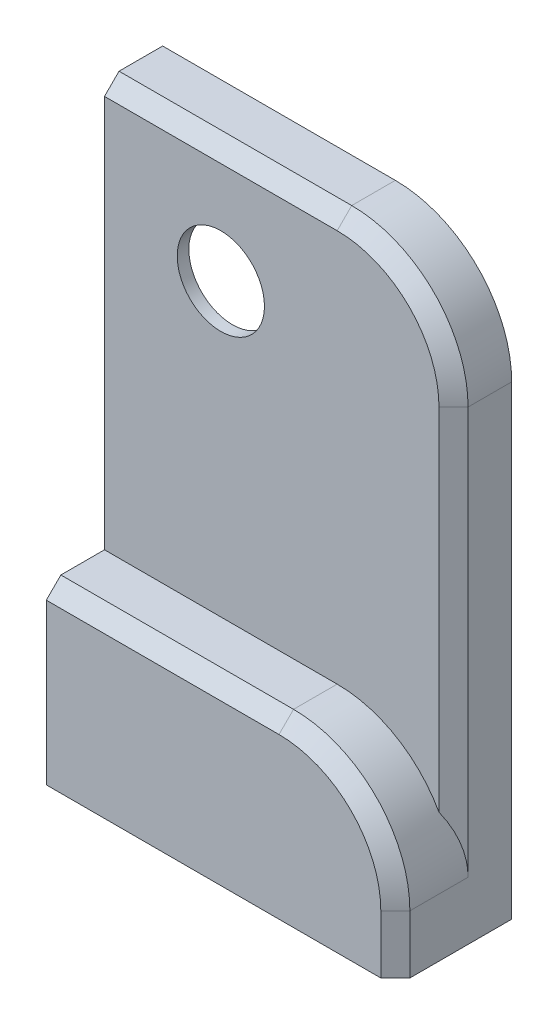
ISO-10303-21;
HEADER;
FILE_DESCRIPTION(('STEP AP214'),'2;1');
FILE_NAME('part.step','',(''),(''),'','','');
FILE_SCHEMA(('AUTOMOTIVE_DESIGN { 1 0 10303 214 1 1 1 1 }'));
ENDSEC;
DATA;
#1=APPLICATION_CONTEXT('core data for automotive mechanical design processes');
#2=APPLICATION_PROTOCOL_DEFINITION('international standard','automotive_design',2000,#1);
#3=PRODUCT_CONTEXT('',#1,'mechanical');
#4=PRODUCT('Part','Part','',(#3));
#5=PRODUCT_RELATED_PRODUCT_CATEGORY('part','',(#4));
#6=PRODUCT_DEFINITION_FORMATION('','',#4);
#7=PRODUCT_DEFINITION_CONTEXT('part definition',#1,'design');
#8=PRODUCT_DEFINITION('design','',#6,#7);
#9=PRODUCT_DEFINITION_SHAPE('','',#8);
#10=(LENGTH_UNIT() NAMED_UNIT(*) SI_UNIT(.MILLI.,.METRE.));
#11=(NAMED_UNIT(*) PLANE_ANGLE_UNIT() SI_UNIT($,.RADIAN.));
#12=(NAMED_UNIT(*) SI_UNIT($,.STERADIAN.) SOLID_ANGLE_UNIT());
#13=UNCERTAINTY_MEASURE_WITH_UNIT(LENGTH_MEASURE(1.E-05),#10,'distance_accuracy_value','');
#14=(GEOMETRIC_REPRESENTATION_CONTEXT(3) GLOBAL_UNCERTAINTY_ASSIGNED_CONTEXT((#13)) GLOBAL_UNIT_ASSIGNED_CONTEXT((#10,
#11,#12)) REPRESENTATION_CONTEXT('',''));
#15=CARTESIAN_POINT('',(0.,0.,0.));
#16=DIRECTION('',(0.,0.,1.));
#17=DIRECTION('',(1.,0.,0.));
#18=AXIS2_PLACEMENT_3D('',#15,#16,#17);
#19=CARTESIAN_POINT('',(0.,0.,0.));
#20=DIRECTION('',(0.,0.,-1.));
#21=DIRECTION('',(-1.,0.,0.));
#22=AXIS2_PLACEMENT_3D('',#19,#20,#21);
#23=PLANE('',#22);
#24=CARTESIAN_POINT('',(-25.4,-25.4,0.));
#25=DIRECTION('',(0.,0.,-1.));
#26=DIRECTION('',(-1.,0.,0.));
#27=AXIS2_PLACEMENT_3D('',#24,#25,#26);
#28=CIRCLE('',#27,22.86);
#29=CARTESIAN_POINT('',(-25.4,-2.54,0.));
#30=VERTEX_POINT('',#29);
#31=CARTESIAN_POINT('',(-2.54,-25.4,0.));
#32=VERTEX_POINT('',#31);
#33=EDGE_CURVE('E278',#30,#32,#28,.T.);
#34=ORIENTED_EDGE('',*,*,#33,.F.);
#35=DIRECTION('',(-1.,0.,0.));
#36=VECTOR('',#35,1.);
#37=CARTESIAN_POINT('',(0.,-2.54,0.));
#38=LINE('',#37,#36);
#39=CARTESIAN_POINT('',(-76.2,-2.54000000000001,0.));
#40=VERTEX_POINT('',#39);
#41=EDGE_CURVE('E264',#30,#40,#38,.T.);
#42=ORIENTED_EDGE('',*,*,#41,.T.);
#43=DIRECTION('',(0.,-1.,0.));
#44=VECTOR('',#43,1.);
#45=CARTESIAN_POINT('',(-76.2,0.,0.));
#46=LINE('',#45,#44);
#47=CARTESIAN_POINT('',(-76.2,0.,0.));
#48=VERTEX_POINT('',#47);
#49=EDGE_CURVE('E338',#48,#40,#46,.T.);
#50=ORIENTED_EDGE('',*,*,#49,.F.);
#51=DIRECTION('',(-1.,0.,0.));
#52=VECTOR('',#51,1.);
#53=CARTESIAN_POINT('',(0.,0.,0.));
#54=LINE('',#53,#52);
#55=CARTESIAN_POINT('',(-25.4,0.,0.));
#56=VERTEX_POINT('',#55);
#57=EDGE_CURVE('E334',#56,#48,#54,.T.);
#58=ORIENTED_EDGE('',*,*,#57,.F.);
#59=CARTESIAN_POINT('',(-25.4,-25.4,0.));
#60=DIRECTION('',(0.,0.,-1.));
#61=DIRECTION('',(-1.,0.,0.));
#62=AXIS2_PLACEMENT_3D('',#59,#60,#61);
#63=CIRCLE('',#62,25.4);
#64=CARTESIAN_POINT('',(0.,-25.4,0.));
#65=VERTEX_POINT('',#64);
#66=EDGE_CURVE('E368',#56,#65,#63,.T.);
#67=ORIENTED_EDGE('',*,*,#66,.T.);
#68=DIRECTION('',(0.,1.,0.));
#69=VECTOR('',#68,1.);
#70=CARTESIAN_POINT('',(0.,0.,0.));
#71=LINE('',#70,#69);
#72=CARTESIAN_POINT('',(0.,-127.,0.));
#73=VERTEX_POINT('',#72);
#74=EDGE_CURVE('E325',#73,#65,#71,.T.);
#75=ORIENTED_EDGE('',*,*,#74,.F.);
#76=DIRECTION('',(1.,0.,0.));
#77=VECTOR('',#76,1.);
#78=CARTESIAN_POINT('',(0.,-127.,0.));
#79=LINE('',#78,#77);
#80=CARTESIAN_POINT('',(-2.54,-127.,0.));
#81=VERTEX_POINT('',#80);
#82=EDGE_CURVE('E330',#81,#73,#79,.T.);
#83=ORIENTED_EDGE('',*,*,#82,.F.);
#84=DIRECTION('',(0.,1.,0.));
#85=VECTOR('',#84,1.);
#86=CARTESIAN_POINT('',(-2.54,0.,0.));
#87=LINE('',#86,#85);
#88=EDGE_CURVE('E277',#81,#32,#87,.T.);
#89=ORIENTED_EDGE('',*,*,#88,.T.);
#90=EDGE_LOOP('',(#34,#42,#50,#58,#67,#75,#83,#89));
#91=FACE_BOUND('',#90,.T.);
#92=ADVANCED_FACE('F42',(#91),#23,.T.);
#93=CARTESIAN_POINT('',(-50.8,-25.4,0.));
#94=DIRECTION('',(0.,0.,1.));
#95=DIRECTION('',(1.,0.,0.));
#96=AXIS2_PLACEMENT_3D('',#93,#94,#95);
#97=CYLINDRICAL_SURFACE('',#96,9.525);
#98=CARTESIAN_POINT('',(-50.8,-25.4,12.7));
#99=DIRECTION('',(0.,0.,1.));
#100=DIRECTION('',(1.,0.,0.));
#101=AXIS2_PLACEMENT_3D('',#98,#99,#100);
#102=CIRCLE('',#101,9.525);
#103=CARTESIAN_POINT('',(-41.275,-25.4,12.7));
#104=VERTEX_POINT('',#103);
#105=EDGE_CURVE('E305',#104,#104,#102,.T.);
#106=ORIENTED_EDGE('',*,*,#105,.T.);
#107=EDGE_LOOP('',(#106));
#108=FACE_BOUND('',#107,.T.);
#109=CARTESIAN_POINT('',(-50.8,-25.4,10.16));
#110=DIRECTION('',(0.,0.,-1.));
#111=DIRECTION('',(-1.,0.,0.));
#112=AXIS2_PLACEMENT_3D('',#109,#110,#111);
#113=CIRCLE('',#112,9.525);
#114=CARTESIAN_POINT('',(-60.325,-25.4,10.16));
#115=VERTEX_POINT('',#114);
#116=EDGE_CURVE('E244',#115,#115,#113,.F.);
#117=ORIENTED_EDGE('',*,*,#116,.F.);
#118=EDGE_LOOP('',(#117));
#119=FACE_BOUND('',#118,.T.);
#120=ADVANCED_FACE('F522',(#108,#119),#97,.F.);
#121=CARTESIAN_POINT('',(0.,0.,12.7));
#122=DIRECTION('',(0.,0.,-1.));
#123=DIRECTION('',(-1.,0.,0.));
#124=AXIS2_PLACEMENT_3D('',#121,#122,#123);
#125=PLANE('',#124);
#126=ORIENTED_EDGE('',*,*,#105,.F.);
#127=EDGE_LOOP('',(#126));
#128=FACE_BOUND('',#127,.T.);
#129=CARTESIAN_POINT('',(-25.4,-114.3,12.7));
#130=DIRECTION('',(0.,0.,-1.));
#131=DIRECTION('',(-1.,0.,0.));
#132=AXIS2_PLACEMENT_3D('',#129,#130,#131);
#133=CIRCLE('',#132,25.4);
#134=CARTESIAN_POINT('',(-25.4,-88.9,12.7));
#135=VERTEX_POINT('',#134);
#136=CARTESIAN_POINT('',(-3.17500000000001,-102.003277875791,12.7));
#137=VERTEX_POINT('',#136);
#138=EDGE_CURVE('E371',#135,#137,#133,.T.);
#139=ORIENTED_EDGE('',*,*,#138,.T.);
#140=DIRECTION('',(0.,1.,0.));
#141=VECTOR('',#140,1.);
#142=CARTESIAN_POINT('',(-3.17500000000001,0.,12.7));
#143=LINE('',#142,#141);
#144=CARTESIAN_POINT('',(-3.17500000000001,-25.4,12.7));
#145=VERTEX_POINT('',#144);
#146=EDGE_CURVE('E413',#137,#145,#143,.T.);
#147=ORIENTED_EDGE('',*,*,#146,.T.);
#148=CARTESIAN_POINT('',(-25.4,-25.4,12.7));
#149=DIRECTION('',(0.,0.,-1.));
#150=DIRECTION('',(-1.,0.,0.));
#151=AXIS2_PLACEMENT_3D('',#148,#149,#150);
#152=CIRCLE('',#151,22.225);
#153=CARTESIAN_POINT('',(-25.4,-3.17500000000001,12.7));
#154=VERTEX_POINT('',#153);
#155=EDGE_CURVE('E410',#145,#154,#152,.F.);
#156=ORIENTED_EDGE('',*,*,#155,.T.);
#157=DIRECTION('',(-1.,0.,0.));
#158=VECTOR('',#157,1.);
#159=CARTESIAN_POINT('',(0.,-3.17500000000001,12.7));
#160=LINE('',#159,#158);
#161=CARTESIAN_POINT('',(-76.2,-3.17500000000002,12.7));
#162=VERTEX_POINT('',#161);
#163=EDGE_CURVE('E407',#154,#162,#160,.T.);
#164=ORIENTED_EDGE('',*,*,#163,.T.);
#165=DIRECTION('',(0.,-1.,0.));
#166=VECTOR('',#165,1.);
#167=CARTESIAN_POINT('',(-76.2,0.,12.7));
#168=LINE('',#167,#166);
#169=CARTESIAN_POINT('',(-76.2,-88.9,12.7));
#170=VERTEX_POINT('',#169);
#171=EDGE_CURVE('E326',#162,#170,#168,.T.);
#172=ORIENTED_EDGE('',*,*,#171,.T.);
#173=DIRECTION('',(-1.,0.,0.));
#174=VECTOR('',#173,1.);
#175=CARTESIAN_POINT('',(-76.2,-88.9,12.7));
#176=LINE('',#175,#174);
#177=EDGE_CURVE('E309',#135,#170,#176,.T.);
#178=ORIENTED_EDGE('',*,*,#177,.F.);
#179=EDGE_LOOP('',(#139,#147,#156,#164,#172,#178));
#180=FACE_BOUND('',#179,.T.);
#181=ADVANCED_FACE('F528',(#128,#180),#125,.F.);
#182=CARTESIAN_POINT('',(0.,0.,12.7));
#183=DIRECTION('',(-1.,0.,0.));
#184=DIRECTION('',(0.,0.,1.));
#185=AXIS2_PLACEMENT_3D('',#182,#183,#184);
#186=PLANE('',#185);
#187=DIRECTION('',(0.,0.,-1.));
#188=VECTOR('',#187,1.);
#189=CARTESIAN_POINT('',(0.,-114.3,12.7));
#190=LINE('',#189,#188);
#191=CARTESIAN_POINT('',(0.,-114.3,9.52499999999999));
#192=VERTEX_POINT('',#191);
#193=CARTESIAN_POINT('',(0.,-114.3,22.225));
#194=VERTEX_POINT('',#193);
#195=EDGE_CURVE('E361',#192,#194,#190,.F.);
#196=ORIENTED_EDGE('',*,*,#195,.T.);
#197=DIRECTION('',(0.,-1.,0.));
#198=VECTOR('',#197,1.);
#199=CARTESIAN_POINT('',(0.,0.,22.225));
#200=LINE('',#199,#198);
#201=CARTESIAN_POINT('',(0.,-127.,22.225));
#202=VERTEX_POINT('',#201);
#203=EDGE_CURVE('E389',#194,#202,#200,.T.);
#204=ORIENTED_EDGE('',*,*,#203,.T.);
#205=DIRECTION('',(0.,0.,-1.));
#206=VECTOR('',#205,1.);
#207=CARTESIAN_POINT('',(0.,-127.,12.7));
#208=LINE('',#207,#206);
#209=EDGE_CURVE('E329',#202,#73,#208,.T.);
#210=ORIENTED_EDGE('',*,*,#209,.T.);
#211=ORIENTED_EDGE('',*,*,#74,.T.);
#212=DIRECTION('',(0.,0.,-1.));
#213=VECTOR('',#212,1.);
#214=CARTESIAN_POINT('',(0.,-25.4,12.7));
#215=LINE('',#214,#213);
#216=CARTESIAN_POINT('',(0.,-25.4,9.52499999999999));
#217=VERTEX_POINT('',#216);
#218=EDGE_CURVE('E357',#65,#217,#215,.F.);
#219=ORIENTED_EDGE('',*,*,#218,.T.);
#220=DIRECTION('',(0.,-1.,0.));
#221=VECTOR('',#220,1.);
#222=CARTESIAN_POINT('',(0.,0.,9.52499999999999));
#223=LINE('',#222,#221);
#224=EDGE_CURVE('E385',#217,#192,#223,.T.);
#225=ORIENTED_EDGE('',*,*,#224,.T.);
#226=EDGE_LOOP('',(#196,#204,#210,#211,#219,#225));
#227=FACE_BOUND('',#226,.T.);
#228=ADVANCED_FACE('F541',(#227),#186,.F.);
#229=CARTESIAN_POINT('',(0.,0.,12.7));
#230=DIRECTION('',(0.,-1.,0.));
#231=DIRECTION('',(1.,0.,0.));
#232=AXIS2_PLACEMENT_3D('',#229,#230,#231);
#233=PLANE('',#232);
#234=DIRECTION('',(0.,0.,-1.));
#235=VECTOR('',#234,1.);
#236=CARTESIAN_POINT('',(-76.2,0.,12.7));
#237=LINE('',#236,#235);
#238=CARTESIAN_POINT('',(-76.2,0.,9.52499999999999));
#239=VERTEX_POINT('',#238);
#240=EDGE_CURVE('E351',#239,#48,#237,.T.);
#241=ORIENTED_EDGE('',*,*,#240,.F.);
#242=DIRECTION('',(1.,0.,0.));
#243=VECTOR('',#242,1.);
#244=CARTESIAN_POINT('',(0.,0.,9.52499999999999));
#245=LINE('',#244,#243);
#246=CARTESIAN_POINT('',(-25.4,0.,9.52499999999999));
#247=VERTEX_POINT('',#246);
#248=EDGE_CURVE('E52',#239,#247,#245,.T.);
#249=ORIENTED_EDGE('',*,*,#248,.T.);
#250=DIRECTION('',(0.,0.,-1.));
#251=VECTOR('',#250,1.);
#252=CARTESIAN_POINT('',(-25.4,0.,12.7));
#253=LINE('',#252,#251);
#254=EDGE_CURVE('E365',#247,#56,#253,.T.);
#255=ORIENTED_EDGE('',*,*,#254,.T.);
#256=ORIENTED_EDGE('',*,*,#57,.T.);
#257=EDGE_LOOP('',(#241,#249,#255,#256));
#258=FACE_BOUND('',#257,.T.);
#259=ADVANCED_FACE('F538',(#258),#233,.F.);
#260=CARTESIAN_POINT('',(-76.2,0.,12.7));
#261=DIRECTION('',(1.,0.,0.));
#262=DIRECTION('',(0.,1.,0.));
#263=AXIS2_PLACEMENT_3D('',#260,#261,#262);
#264=PLANE('',#263);
#265=DIRECTION('',(0.,-0.707106781186546,0.707106781186549));
#266=VECTOR('',#265,1.);
#267=CARTESIAN_POINT('',(-76.2,-93.8710512242138,23.6039487757862));
#268=LINE('',#267,#266);
#269=CARTESIAN_POINT('',(-76.2,-93.1271024484276,22.86));
#270=VERTEX_POINT('',#269);
#271=CARTESIAN_POINT('',(-76.2,-91.44,21.1728975515723));
#272=VERTEX_POINT('',#271);
#273=EDGE_CURVE('E268',#270,#272,#268,.F.);
#274=ORIENTED_EDGE('',*,*,#273,.F.);
#275=DIRECTION('',(0.,-1.,0.));
#276=VECTOR('',#275,1.);
#277=CARTESIAN_POINT('',(-76.2,0.,22.86));
#278=LINE('',#277,#276);
#279=CARTESIAN_POINT('',(-76.2,-127.,22.86));
#280=VERTEX_POINT('',#279);
#281=EDGE_CURVE('E297',#270,#280,#278,.T.);
#282=ORIENTED_EDGE('',*,*,#281,.T.);
#283=DIRECTION('',(0.,0.,-1.));
#284=VECTOR('',#283,1.);
#285=CARTESIAN_POINT('',(-76.2,-127.,12.7));
#286=LINE('',#285,#284);
#287=CARTESIAN_POINT('',(-76.2,-127.,25.4));
#288=VERTEX_POINT('',#287);
#289=EDGE_CURVE('E347',#288,#280,#286,.T.);
#290=ORIENTED_EDGE('',*,*,#289,.F.);
#291=DIRECTION('',(0.,-1.,0.));
#292=VECTOR('',#291,1.);
#293=CARTESIAN_POINT('',(-76.2,-127.,25.4));
#294=LINE('',#293,#292);
#295=CARTESIAN_POINT('',(-76.2,-92.075,25.4));
#296=VERTEX_POINT('',#295);
#297=EDGE_CURVE('E311',#296,#288,#294,.T.);
#298=ORIENTED_EDGE('',*,*,#297,.F.);
#299=DIRECTION('',(0.,-0.707106781186546,0.707106781186549));
#300=VECTOR('',#299,1.);
#301=CARTESIAN_POINT('',(-76.2,-92.075,25.4));
#302=LINE('',#301,#300);
#303=CARTESIAN_POINT('',(-76.2,-88.9,22.225));
#304=VERTEX_POINT('',#303);
#305=EDGE_CURVE('E401',#296,#304,#302,.F.);
#306=ORIENTED_EDGE('',*,*,#305,.T.);
#307=DIRECTION('',(0.,0.,-1.));
#308=VECTOR('',#307,1.);
#309=CARTESIAN_POINT('',(-76.2,-88.9,25.4));
#310=LINE('',#309,#308);
#311=EDGE_CURVE('E318',#304,#170,#310,.T.);
#312=ORIENTED_EDGE('',*,*,#311,.T.);
#313=ORIENTED_EDGE('',*,*,#171,.F.);
#314=DIRECTION('',(0.,-0.707106781186548,0.707106781186548));
#315=VECTOR('',#314,1.);
#316=CARTESIAN_POINT('',(-76.2,-3.17500000000001,12.7));
#317=LINE('',#316,#315);
#318=EDGE_CURVE('E398',#162,#239,#317,.F.);
#319=ORIENTED_EDGE('',*,*,#318,.T.);
#320=ORIENTED_EDGE('',*,*,#240,.T.);
#321=ORIENTED_EDGE('',*,*,#49,.T.);
#322=DIRECTION('',(0.,0.,-1.));
#323=VECTOR('',#322,1.);
#324=CARTESIAN_POINT('',(-76.2,-2.54000000000001,12.7));
#325=LINE('',#324,#323);
#326=CARTESIAN_POINT('',(-76.2,-2.54000000000001,8.47289755157233));
#327=VERTEX_POINT('',#326);
#328=EDGE_CURVE('E270',#327,#40,#325,.T.);
#329=ORIENTED_EDGE('',*,*,#328,.F.);
#330=DIRECTION('',(0.,-0.707106781186548,0.707106781186548));
#331=VECTOR('',#330,1.);
#332=CARTESIAN_POINT('',(-76.2,-4.97105122421384,10.9039487757862));
#333=LINE('',#332,#331);
#334=CARTESIAN_POINT('',(-76.2,-4.22710244842768,10.16));
#335=VERTEX_POINT('',#334);
#336=EDGE_CURVE('E265',#335,#327,#333,.F.);
#337=ORIENTED_EDGE('',*,*,#336,.F.);
#338=DIRECTION('',(0.,-1.,0.));
#339=VECTOR('',#338,1.);
#340=CARTESIAN_POINT('',(-76.2,0.,10.16));
#341=LINE('',#340,#339);
#342=CARTESIAN_POINT('',(-76.2,-91.44,10.16));
#343=VERTEX_POINT('',#342);
#344=EDGE_CURVE('E220',#335,#343,#341,.T.);
#345=ORIENTED_EDGE('',*,*,#344,.T.);
#346=DIRECTION('',(0.,0.,-1.));
#347=VECTOR('',#346,1.);
#348=CARTESIAN_POINT('',(-76.2,-91.44,12.7));
#349=LINE('',#348,#347);
#350=EDGE_CURVE('E285',#272,#343,#349,.T.);
#351=ORIENTED_EDGE('',*,*,#350,.F.);
#352=EDGE_LOOP('',(#274,#282,#290,#298,#306,#312,#313,#319,#320,#321,#329,#337,#345,#351));
#353=FACE_BOUND('',#352,.T.);
#354=ADVANCED_FACE('F495',(#353),#264,.F.);
#355=CARTESIAN_POINT('',(0.,-127.,12.7));
#356=DIRECTION('',(0.,1.,0.));
#357=DIRECTION('',(-1.,0.,0.));
#358=AXIS2_PLACEMENT_3D('',#355,#356,#357);
#359=PLANE('',#358);
#360=DIRECTION('',(0.707106781186546,0.,-0.707106781186549));
#361=VECTOR('',#360,1.);
#362=CARTESIAN_POINT('',(-4.97105122421385,-127.,23.6039487757862));
#363=LINE('',#362,#361);
#364=CARTESIAN_POINT('',(-2.54,-127.,21.1728975515723));
#365=VERTEX_POINT('',#364);
#366=CARTESIAN_POINT('',(-4.22710244842766,-127.,22.86));
#367=VERTEX_POINT('',#366);
#368=EDGE_CURVE('E289',#365,#367,#363,.F.);
#369=ORIENTED_EDGE('',*,*,#368,.F.);
#370=DIRECTION('',(0.,0.,-1.));
#371=VECTOR('',#370,1.);
#372=CARTESIAN_POINT('',(-2.54,-127.,12.7));
#373=LINE('',#372,#371);
#374=EDGE_CURVE('E263',#365,#81,#373,.T.);
#375=ORIENTED_EDGE('',*,*,#374,.T.);
#376=ORIENTED_EDGE('',*,*,#82,.T.);
#377=ORIENTED_EDGE('',*,*,#209,.F.);
#378=DIRECTION('',(0.707106781186546,0.,-0.707106781186549));
#379=VECTOR('',#378,1.);
#380=CARTESIAN_POINT('',(-3.17500000000002,-127.,25.4));
#381=LINE('',#380,#379);
#382=CARTESIAN_POINT('',(-3.17500000000003,-127.,25.4));
#383=VERTEX_POINT('',#382);
#384=EDGE_CURVE('E392',#202,#383,#381,.F.);
#385=ORIENTED_EDGE('',*,*,#384,.T.);
#386=DIRECTION('',(1.,0.,0.));
#387=VECTOR('',#386,1.);
#388=CARTESIAN_POINT('',(-76.2,-127.,25.4));
#389=LINE('',#388,#387);
#390=EDGE_CURVE('E314',#288,#383,#389,.T.);
#391=ORIENTED_EDGE('',*,*,#390,.F.);
#392=ORIENTED_EDGE('',*,*,#289,.T.);
#393=DIRECTION('',(1.,0.,0.));
#394=VECTOR('',#393,1.);
#395=CARTESIAN_POINT('',(0.,-127.,22.86));
#396=LINE('',#395,#394);
#397=EDGE_CURVE('E293',#280,#367,#396,.T.);
#398=ORIENTED_EDGE('',*,*,#397,.T.);
#399=EDGE_LOOP('',(#369,#375,#376,#377,#385,#391,#392,#398));
#400=FACE_BOUND('',#399,.T.);
#401=ADVANCED_FACE('F489',(#400),#359,.F.);
#402=CARTESIAN_POINT('',(-76.2,-88.9,25.4));
#403=DIRECTION('',(0.,-1.,0.));
#404=DIRECTION('',(0.,0.,-1.));
#405=AXIS2_PLACEMENT_3D('',#402,#403,#404);
#406=PLANE('',#405);
#407=ORIENTED_EDGE('',*,*,#311,.F.);
#408=DIRECTION('',(1.,0.,0.));
#409=VECTOR('',#408,1.);
#410=CARTESIAN_POINT('',(-76.2,-88.9,22.225));
#411=LINE('',#410,#409);
#412=CARTESIAN_POINT('',(-25.4,-88.9,22.225));
#413=VERTEX_POINT('',#412);
#414=EDGE_CURVE('E404',#304,#413,#411,.T.);
#415=ORIENTED_EDGE('',*,*,#414,.T.);
#416=DIRECTION('',(0.,0.,-1.));
#417=VECTOR('',#416,1.);
#418=CARTESIAN_POINT('',(-25.4,-88.9,25.4));
#419=LINE('',#418,#417);
#420=EDGE_CURVE('E354',#413,#135,#419,.T.);
#421=ORIENTED_EDGE('',*,*,#420,.T.);
#422=ORIENTED_EDGE('',*,*,#177,.T.);
#423=EDGE_LOOP('',(#407,#415,#421,#422));
#424=FACE_BOUND('',#423,.T.);
#425=ADVANCED_FACE('F535',(#424),#406,.F.);
#426=CARTESIAN_POINT('',(0.,0.,25.4));
#427=DIRECTION('',(0.,0.,-1.));
#428=DIRECTION('',(-1.,0.,0.));
#429=AXIS2_PLACEMENT_3D('',#426,#427,#428);
#430=PLANE('',#429);
#431=ORIENTED_EDGE('',*,*,#390,.T.);
#432=DIRECTION('',(0.,1.,0.));
#433=VECTOR('',#432,1.);
#434=CARTESIAN_POINT('',(-3.175,0.,25.4));
#435=LINE('',#434,#433);
#436=CARTESIAN_POINT('',(-3.17499999999999,-114.3,25.4));
#437=VERTEX_POINT('',#436);
#438=EDGE_CURVE('E381',#383,#437,#435,.T.);
#439=ORIENTED_EDGE('',*,*,#438,.T.);
#440=CARTESIAN_POINT('',(-25.4,-114.3,25.4));
#441=DIRECTION('',(0.,0.,-1.));
#442=DIRECTION('',(-1.,0.,0.));
#443=AXIS2_PLACEMENT_3D('',#440,#441,#442);
#444=CIRCLE('',#443,22.225);
#445=CARTESIAN_POINT('',(-25.4,-92.075,25.4));
#446=VERTEX_POINT('',#445);
#447=EDGE_CURVE('E378',#437,#446,#444,.F.);
#448=ORIENTED_EDGE('',*,*,#447,.T.);
#449=DIRECTION('',(-1.,0.,0.));
#450=VECTOR('',#449,1.);
#451=CARTESIAN_POINT('',(0.,-92.075,25.4));
#452=LINE('',#451,#450);
#453=EDGE_CURVE('E375',#446,#296,#452,.T.);
#454=ORIENTED_EDGE('',*,*,#453,.T.);
#455=ORIENTED_EDGE('',*,*,#297,.T.);
#456=EDGE_LOOP('',(#431,#439,#448,#454,#455));
#457=FACE_BOUND('',#456,.T.);
#458=ADVANCED_FACE('F549',(#457),#430,.F.);
#459=CARTESIAN_POINT('',(-25.4,-114.3,25.4));
#460=DIRECTION('',(0.,0.,-1.));
#461=DIRECTION('',(-1.,0.,0.));
#462=AXIS2_PLACEMENT_3D('',#459,#460,#461);
#463=CYLINDRICAL_SURFACE('',#462,25.4);
#464=ORIENTED_EDGE('',*,*,#420,.F.);
#465=CARTESIAN_POINT('',(-25.4,-114.3,22.225));
#466=DIRECTION('',(0.,0.,-1.));
#467=DIRECTION('',(-1.,0.,0.));
#468=AXIS2_PLACEMENT_3D('',#465,#466,#467);
#469=CIRCLE('',#468,25.4);
#470=EDGE_CURVE('E395',#413,#194,#469,.T.);
#471=ORIENTED_EDGE('',*,*,#470,.T.);
#472=ORIENTED_EDGE('',*,*,#195,.F.);
#473=CARTESIAN_POINT('',(-25.4,-114.3,34.925));
#474=DIRECTION('',(-0.707106781186548,0.,-0.707106781186548));
#475=DIRECTION('',(0.707106781186548,0.,-0.707106781186548));
#476=AXIS2_PLACEMENT_3D('',#473,#474,#475);
#477=ELLIPSE('',#476,35.9210244842766,25.4);
#478=EDGE_CURVE('E11',#192,#137,#477,.F.);
#479=ORIENTED_EDGE('',*,*,#478,.T.);
#480=ORIENTED_EDGE('',*,*,#138,.F.);
#481=EDGE_LOOP('',(#464,#471,#472,#479,#480));
#482=FACE_BOUND('',#481,.T.);
#483=ADVANCED_FACE('F545',(#482),#463,.T.);
#484=CARTESIAN_POINT('',(-25.4,-25.4,12.7));
#485=DIRECTION('',(0.,0.,-1.));
#486=DIRECTION('',(-1.,0.,0.));
#487=AXIS2_PLACEMENT_3D('',#484,#485,#486);
#488=CYLINDRICAL_SURFACE('',#487,25.4);
#489=ORIENTED_EDGE('',*,*,#254,.F.);
#490=CARTESIAN_POINT('',(-25.4,-25.4,9.52499999999999));
#491=DIRECTION('',(0.,0.,-1.));
#492=DIRECTION('',(-1.,0.,0.));
#493=AXIS2_PLACEMENT_3D('',#490,#491,#492);
#494=CIRCLE('',#493,25.4);
#495=EDGE_CURVE('E417',#247,#217,#494,.T.);
#496=ORIENTED_EDGE('',*,*,#495,.T.);
#497=ORIENTED_EDGE('',*,*,#218,.F.);
#498=ORIENTED_EDGE('',*,*,#66,.F.);
#499=EDGE_LOOP('',(#489,#496,#497,#498));
#500=FACE_BOUND('',#499,.T.);
#501=ADVANCED_FACE('F548',(#500),#488,.T.);
#502=CARTESIAN_POINT('',(0.,-92.075,25.4));
#503=DIRECTION('',(0.,-0.707106781186549,-0.707106781186546));
#504=DIRECTION('',(-1.,0.,0.));
#505=AXIS2_PLACEMENT_3D('',#502,#503,#504);
#506=PLANE('',#505);
#507=ORIENTED_EDGE('',*,*,#305,.F.);
#508=ORIENTED_EDGE('',*,*,#453,.F.);
#509=DIRECTION('',(0.,-0.707106781186546,0.707106781186549));
#510=VECTOR('',#509,1.);
#511=CARTESIAN_POINT('',(-25.4,-88.9,22.225));
#512=LINE('',#511,#510);
#513=EDGE_CURVE('E310',#413,#446,#512,.T.);
#514=ORIENTED_EDGE('',*,*,#513,.F.);
#515=ORIENTED_EDGE('',*,*,#414,.F.);
#516=EDGE_LOOP('',(#507,#508,#514,#515));
#517=FACE_BOUND('',#516,.T.);
#518=ADVANCED_FACE('F553',(#517),#506,.F.);
#519=CARTESIAN_POINT('',(-25.4,-114.3,25.4));
#520=DIRECTION('',(0.,0.,-1.));
#521=DIRECTION('',(-1.,0.,0.));
#522=AXIS2_PLACEMENT_3D('',#519,#520,#521);
#523=CONICAL_SURFACE('',#522,22.225,0.785398163397445);
#524=ORIENTED_EDGE('',*,*,#513,.T.);
#525=ORIENTED_EDGE('',*,*,#447,.F.);
#526=DIRECTION('',(-0.707106781186545,0.,0.70710678118655));
#527=VECTOR('',#526,1.);
#528=CARTESIAN_POINT('',(0.,-114.3,22.225));
#529=LINE('',#528,#527);
#530=EDGE_CURVE('E422',#194,#437,#529,.T.);
#531=ORIENTED_EDGE('',*,*,#530,.F.);
#532=ORIENTED_EDGE('',*,*,#470,.F.);
#533=EDGE_LOOP('',(#524,#525,#531,#532));
#534=FACE_BOUND('',#533,.T.);
#535=ADVANCED_FACE('F558',(#534),#523,.T.);
#536=CARTESIAN_POINT('',(-3.175,0.,25.4));
#537=DIRECTION('',(-0.707106781186549,0.,-0.707106781186546));
#538=DIRECTION('',(0.,1.,0.));
#539=AXIS2_PLACEMENT_3D('',#536,#537,#538);
#540=PLANE('',#539);
#541=ORIENTED_EDGE('',*,*,#384,.F.);
#542=ORIENTED_EDGE('',*,*,#203,.F.);
#543=ORIENTED_EDGE('',*,*,#530,.T.);
#544=ORIENTED_EDGE('',*,*,#438,.F.);
#545=EDGE_LOOP('',(#541,#542,#543,#544));
#546=FACE_BOUND('',#545,.T.);
#547=ADVANCED_FACE('F555',(#546),#540,.F.);
#548=CARTESIAN_POINT('',(0.,-3.17500000000001,12.7));
#549=DIRECTION('',(0.,-0.707106781186548,-0.707106781186548));
#550=DIRECTION('',(-1.,0.,0.));
#551=AXIS2_PLACEMENT_3D('',#548,#549,#550);
#552=PLANE('',#551);
#553=ORIENTED_EDGE('',*,*,#318,.F.);
#554=ORIENTED_EDGE('',*,*,#163,.F.);
#555=DIRECTION('',(0.,-0.707106781186548,0.707106781186548));
#556=VECTOR('',#555,1.);
#557=CARTESIAN_POINT('',(-25.4,0.,9.52499999999999));
#558=LINE('',#557,#556);
#559=EDGE_CURVE('E46',#247,#154,#558,.T.);
#560=ORIENTED_EDGE('',*,*,#559,.F.);
#561=ORIENTED_EDGE('',*,*,#248,.F.);
#562=EDGE_LOOP('',(#553,#554,#560,#561));
#563=FACE_BOUND('',#562,.T.);
#564=ADVANCED_FACE('F44',(#563),#552,.F.);
#565=CARTESIAN_POINT('',(-25.4,-25.4,12.7));
#566=DIRECTION('',(0.,0.,-1.));
#567=DIRECTION('',(-1.,0.,0.));
#568=AXIS2_PLACEMENT_3D('',#565,#566,#567);
#569=CONICAL_SURFACE('',#568,22.225,0.785398163397448);
#570=ORIENTED_EDGE('',*,*,#559,.T.);
#571=ORIENTED_EDGE('',*,*,#155,.F.);
#572=DIRECTION('',(-0.707106781186548,0.,0.707106781186548));
#573=VECTOR('',#572,1.);
#574=CARTESIAN_POINT('',(0.,-25.4,9.52499999999999));
#575=LINE('',#574,#573);
#576=EDGE_CURVE('E427',#217,#145,#575,.T.);
#577=ORIENTED_EDGE('',*,*,#576,.F.);
#578=ORIENTED_EDGE('',*,*,#495,.F.);
#579=EDGE_LOOP('',(#570,#571,#577,#578));
#580=FACE_BOUND('',#579,.T.);
#581=ADVANCED_FACE('F568',(#580),#569,.T.);
#582=CARTESIAN_POINT('',(-3.17500000000001,0.,12.7));
#583=DIRECTION('',(-0.707106781186548,0.,-0.707106781186548));
#584=DIRECTION('',(0.,1.,0.));
#585=AXIS2_PLACEMENT_3D('',#582,#583,#584);
#586=PLANE('',#585);
#587=ORIENTED_EDGE('',*,*,#478,.F.);
#588=ORIENTED_EDGE('',*,*,#224,.F.);
#589=ORIENTED_EDGE('',*,*,#576,.T.);
#590=ORIENTED_EDGE('',*,*,#146,.F.);
#591=EDGE_LOOP('',(#587,#588,#589,#590));
#592=FACE_BOUND('',#591,.T.);
#593=ADVANCED_FACE('F566',(#592),#586,.F.);
#594=CARTESIAN_POINT('',(0.,0.,10.16));
#595=DIRECTION('',(0.,0.,-1.));
#596=DIRECTION('',(-1.,0.,0.));
#597=AXIS2_PLACEMENT_3D('',#594,#595,#596);
#598=PLANE('',#597);
#599=ORIENTED_EDGE('',*,*,#116,.T.);
#600=EDGE_LOOP('',(#599));
#601=FACE_BOUND('',#600,.T.);
#602=CARTESIAN_POINT('',(-25.4,-114.3,10.16));
#603=DIRECTION('',(0.,0.,-1.));
#604=DIRECTION('',(-1.,0.,0.));
#605=AXIS2_PLACEMENT_3D('',#602,#603,#604);
#606=CIRCLE('',#605,22.86);
#607=CARTESIAN_POINT('',(-25.4,-91.44,10.16));
#608=VERTEX_POINT('',#607);
#609=CARTESIAN_POINT('',(-4.22710244842767,-105.680950790799,10.16));
#610=VERTEX_POINT('',#609);
#611=EDGE_CURVE('E256',#608,#610,#606,.T.);
#612=ORIENTED_EDGE('',*,*,#611,.F.);
#613=DIRECTION('',(-1.,0.,0.));
#614=VECTOR('',#613,1.);
#615=CARTESIAN_POINT('',(0.,-91.44,10.16));
#616=LINE('',#615,#614);
#617=EDGE_CURVE('E260',#608,#343,#616,.T.);
#618=ORIENTED_EDGE('',*,*,#617,.T.);
#619=ORIENTED_EDGE('',*,*,#344,.F.);
#620=DIRECTION('',(1.,0.,0.));
#621=VECTOR('',#620,1.);
#622=CARTESIAN_POINT('',(0.,-4.22710244842767,10.16));
#623=LINE('',#622,#621);
#624=CARTESIAN_POINT('',(-25.4,-4.22710244842768,10.16));
#625=VERTEX_POINT('',#624);
#626=EDGE_CURVE('E213',#625,#335,#623,.F.);
#627=ORIENTED_EDGE('',*,*,#626,.F.);
#628=CARTESIAN_POINT('',(-25.4,-25.4,10.16));
#629=DIRECTION('',(0.,0.,-1.));
#630=DIRECTION('',(-1.,0.,0.));
#631=AXIS2_PLACEMENT_3D('',#628,#629,#630);
#632=CIRCLE('',#631,21.1728975515723);
#633=CARTESIAN_POINT('',(-4.22710244842767,-25.4,10.16));
#634=VERTEX_POINT('',#633);
#635=EDGE_CURVE('E200',#634,#625,#632,.F.);
#636=ORIENTED_EDGE('',*,*,#635,.F.);
#637=DIRECTION('',(0.,-1.,0.));
#638=VECTOR('',#637,1.);
#639=CARTESIAN_POINT('',(-4.22710244842767,0.,10.16));
#640=LINE('',#639,#638);
#641=EDGE_CURVE('E212',#610,#634,#640,.F.);
#642=ORIENTED_EDGE('',*,*,#641,.F.);
#643=EDGE_LOOP('',(#612,#618,#619,#627,#636,#642));
#644=FACE_BOUND('',#643,.T.);
#645=ADVANCED_FACE('F217',(#601,#644),#598,.T.);
#646=CARTESIAN_POINT('',(-2.54,0.,12.7));
#647=DIRECTION('',(-1.,0.,0.));
#648=DIRECTION('',(0.,0.,1.));
#649=AXIS2_PLACEMENT_3D('',#646,#647,#648);
#650=PLANE('',#649);
#651=DIRECTION('',(0.,0.,1.));
#652=VECTOR('',#651,1.);
#653=CARTESIAN_POINT('',(-2.54,-114.3,12.7));
#654=LINE('',#653,#652);
#655=CARTESIAN_POINT('',(-2.54,-114.3,8.47289755157233));
#656=VERTEX_POINT('',#655);
#657=CARTESIAN_POINT('',(-2.54,-114.3,21.1728975515723));
#658=VERTEX_POINT('',#657);
#659=EDGE_CURVE('E447',#656,#658,#654,.T.);
#660=ORIENTED_EDGE('',*,*,#659,.F.);
#661=DIRECTION('',(0.,1.,0.));
#662=VECTOR('',#661,1.);
#663=CARTESIAN_POINT('',(-2.54,0.,8.47289755157233));
#664=LINE('',#663,#662);
#665=CARTESIAN_POINT('',(-2.54,-25.4,8.47289755157233));
#666=VERTEX_POINT('',#665);
#667=EDGE_CURVE('E253',#666,#656,#664,.F.);
#668=ORIENTED_EDGE('',*,*,#667,.F.);
#669=DIRECTION('',(0.,0.,1.));
#670=VECTOR('',#669,1.);
#671=CARTESIAN_POINT('',(-2.54,-25.4,12.7));
#672=LINE('',#671,#670);
#673=EDGE_CURVE('E60',#32,#666,#672,.T.);
#674=ORIENTED_EDGE('',*,*,#673,.F.);
#675=ORIENTED_EDGE('',*,*,#88,.F.);
#676=ORIENTED_EDGE('',*,*,#374,.F.);
#677=DIRECTION('',(0.,1.,0.));
#678=VECTOR('',#677,1.);
#679=CARTESIAN_POINT('',(-2.54,0.,21.1728975515723));
#680=LINE('',#679,#678);
#681=EDGE_CURVE('E292',#658,#365,#680,.F.);
#682=ORIENTED_EDGE('',*,*,#681,.F.);
#683=EDGE_LOOP('',(#660,#668,#674,#675,#676,#682));
#684=FACE_BOUND('',#683,.T.);
#685=ADVANCED_FACE('F479',(#684),#650,.T.);
#686=CARTESIAN_POINT('',(0.,-2.54,12.7));
#687=DIRECTION('',(0.,-1.,0.));
#688=DIRECTION('',(1.,0.,0.));
#689=AXIS2_PLACEMENT_3D('',#686,#687,#688);
#690=PLANE('',#689);
#691=ORIENTED_EDGE('',*,*,#328,.T.);
#692=ORIENTED_EDGE('',*,*,#41,.F.);
#693=DIRECTION('',(0.,0.,1.));
#694=VECTOR('',#693,1.);
#695=CARTESIAN_POINT('',(-25.4,-2.54,12.7));
#696=LINE('',#695,#694);
#697=CARTESIAN_POINT('',(-25.4,-2.54,8.47289755157233));
#698=VERTEX_POINT('',#697);
#699=EDGE_CURVE('E281',#698,#30,#696,.F.);
#700=ORIENTED_EDGE('',*,*,#699,.F.);
#701=DIRECTION('',(-1.,0.,0.));
#702=VECTOR('',#701,1.);
#703=CARTESIAN_POINT('',(0.,-2.54,8.47289755157233));
#704=LINE('',#703,#702);
#705=EDGE_CURVE('E228',#327,#698,#704,.F.);
#706=ORIENTED_EDGE('',*,*,#705,.F.);
#707=EDGE_LOOP('',(#691,#692,#700,#706));
#708=FACE_BOUND('',#707,.T.);
#709=ADVANCED_FACE('F508',(#708),#690,.T.);
#710=CARTESIAN_POINT('',(-76.2,-91.44,25.4));
#711=DIRECTION('',(0.,-1.,0.));
#712=DIRECTION('',(0.,0.,-1.));
#713=AXIS2_PLACEMENT_3D('',#710,#711,#712);
#714=PLANE('',#713);
#715=ORIENTED_EDGE('',*,*,#350,.T.);
#716=ORIENTED_EDGE('',*,*,#617,.F.);
#717=DIRECTION('',(0.,0.,-1.));
#718=VECTOR('',#717,1.);
#719=CARTESIAN_POINT('',(-25.4,-91.44,25.4));
#720=LINE('',#719,#718);
#721=CARTESIAN_POINT('',(-25.4,-91.44,21.1728975515723));
#722=VERTEX_POINT('',#721);
#723=EDGE_CURVE('E273',#722,#608,#720,.T.);
#724=ORIENTED_EDGE('',*,*,#723,.F.);
#725=DIRECTION('',(-1.,0.,0.));
#726=VECTOR('',#725,1.);
#727=CARTESIAN_POINT('',(0.,-91.44,21.1728975515723));
#728=LINE('',#727,#726);
#729=EDGE_CURVE('E224',#272,#722,#728,.F.);
#730=ORIENTED_EDGE('',*,*,#729,.F.);
#731=EDGE_LOOP('',(#715,#716,#724,#730));
#732=FACE_BOUND('',#731,.T.);
#733=ADVANCED_FACE('F504',(#732),#714,.T.);
#734=CARTESIAN_POINT('',(0.,0.,22.86));
#735=DIRECTION('',(0.,0.,-1.));
#736=DIRECTION('',(-1.,0.,0.));
#737=AXIS2_PLACEMENT_3D('',#734,#735,#736);
#738=PLANE('',#737);
#739=ORIENTED_EDGE('',*,*,#397,.F.);
#740=ORIENTED_EDGE('',*,*,#281,.F.);
#741=DIRECTION('',(1.,0.,0.));
#742=VECTOR('',#741,1.);
#743=CARTESIAN_POINT('',(0.,-93.1271024484276,22.86));
#744=LINE('',#743,#742);
#745=CARTESIAN_POINT('',(-25.4,-93.1271024484276,22.86));
#746=VERTEX_POINT('',#745);
#747=EDGE_CURVE('E248',#746,#270,#744,.F.);
#748=ORIENTED_EDGE('',*,*,#747,.F.);
#749=CARTESIAN_POINT('',(-25.4,-114.3,22.86));
#750=DIRECTION('',(0.,0.,-1.));
#751=DIRECTION('',(-1.,0.,0.));
#752=AXIS2_PLACEMENT_3D('',#749,#750,#751);
#753=CIRCLE('',#752,21.1728975515723);
#754=CARTESIAN_POINT('',(-4.22710244842766,-114.3,22.86));
#755=VERTEX_POINT('',#754);
#756=EDGE_CURVE('E245',#755,#746,#753,.F.);
#757=ORIENTED_EDGE('',*,*,#756,.F.);
#758=DIRECTION('',(0.,-1.,0.));
#759=VECTOR('',#758,1.);
#760=CARTESIAN_POINT('',(-4.22710244842766,0.,22.86));
#761=LINE('',#760,#759);
#762=EDGE_CURVE('E247',#367,#755,#761,.F.);
#763=ORIENTED_EDGE('',*,*,#762,.F.);
#764=EDGE_LOOP('',(#739,#740,#748,#757,#763));
#765=FACE_BOUND('',#764,.T.);
#766=ADVANCED_FACE('F485',(#765),#738,.T.);
#767=CARTESIAN_POINT('',(-25.4,-114.3,25.4));
#768=DIRECTION('',(0.,0.,-1.));
#769=DIRECTION('',(-1.,0.,0.));
#770=AXIS2_PLACEMENT_3D('',#767,#768,#769);
#771=CYLINDRICAL_SURFACE('',#770,22.86);
#772=ORIENTED_EDGE('',*,*,#723,.T.);
#773=ORIENTED_EDGE('',*,*,#611,.T.);
#774=CARTESIAN_POINT('',(-25.4,-114.3,31.3328975515723));
#775=DIRECTION('',(-0.707106781186548,0.,-0.707106781186548));
#776=DIRECTION('',(0.707106781186548,0.,-0.707106781186548));
#777=AXIS2_PLACEMENT_3D('',#774,#775,#776);
#778=ELLIPSE('',#777,32.3289220358489,22.86);
#779=EDGE_CURVE('E429',#656,#610,#778,.F.);
#780=ORIENTED_EDGE('',*,*,#779,.F.);
#781=ORIENTED_EDGE('',*,*,#659,.T.);
#782=CARTESIAN_POINT('',(-25.4,-114.3,21.1728975515723));
#783=DIRECTION('',(0.,0.,-1.));
#784=DIRECTION('',(-1.,0.,0.));
#785=AXIS2_PLACEMENT_3D('',#782,#783,#784);
#786=CIRCLE('',#785,22.86);
#787=EDGE_CURVE('E269',#722,#658,#786,.T.);
#788=ORIENTED_EDGE('',*,*,#787,.F.);
#789=EDGE_LOOP('',(#772,#773,#780,#781,#788));
#790=FACE_BOUND('',#789,.T.);
#791=ADVANCED_FACE('F476',(#790),#771,.F.);
#792=CARTESIAN_POINT('',(-25.4,-25.4,12.7));
#793=DIRECTION('',(0.,0.,-1.));
#794=DIRECTION('',(-1.,0.,0.));
#795=AXIS2_PLACEMENT_3D('',#792,#793,#794);
#796=CYLINDRICAL_SURFACE('',#795,22.86);
#797=ORIENTED_EDGE('',*,*,#699,.T.);
#798=ORIENTED_EDGE('',*,*,#33,.T.);
#799=ORIENTED_EDGE('',*,*,#673,.T.);
#800=CARTESIAN_POINT('',(-25.4,-25.4,8.47289755157233));
#801=DIRECTION('',(0.,0.,-1.));
#802=DIRECTION('',(-1.,0.,0.));
#803=AXIS2_PLACEMENT_3D('',#800,#801,#802);
#804=CIRCLE('',#803,22.86);
#805=EDGE_CURVE('E444',#698,#666,#804,.T.);
#806=ORIENTED_EDGE('',*,*,#805,.F.);
#807=EDGE_LOOP('',(#797,#798,#799,#806));
#808=FACE_BOUND('',#807,.T.);
#809=ADVANCED_FACE('F512',(#808),#796,.F.);
#810=CARTESIAN_POINT('',(0.,-93.8710512242138,23.6039487757862));
#811=DIRECTION('',(0.,-0.707106781186549,-0.707106781186546));
#812=DIRECTION('',(-1.,0.,0.));
#813=AXIS2_PLACEMENT_3D('',#810,#811,#812);
#814=PLANE('',#813);
#815=ORIENTED_EDGE('',*,*,#273,.T.);
#816=ORIENTED_EDGE('',*,*,#729,.T.);
#817=DIRECTION('',(0.,0.707106781186545,-0.70710678118655));
#818=VECTOR('',#817,1.);
#819=CARTESIAN_POINT('',(-25.4,-93.8710512242138,23.6039487757862));
#820=LINE('',#819,#818);
#821=EDGE_CURVE('E235',#722,#746,#820,.F.);
#822=ORIENTED_EDGE('',*,*,#821,.T.);
#823=ORIENTED_EDGE('',*,*,#747,.T.);
#824=EDGE_LOOP('',(#815,#816,#822,#823));
#825=FACE_BOUND('',#824,.T.);
#826=ADVANCED_FACE('F499',(#825),#814,.T.);
#827=CARTESIAN_POINT('',(-25.4,-114.3,23.6039487757862));
#828=DIRECTION('',(0.,0.,-1.));
#829=DIRECTION('',(-1.,0.,0.));
#830=AXIS2_PLACEMENT_3D('',#827,#828,#829);
#831=CONICAL_SURFACE('',#830,20.4289487757862,0.785398163397445);
#832=ORIENTED_EDGE('',*,*,#821,.F.);
#833=ORIENTED_EDGE('',*,*,#787,.T.);
#834=DIRECTION('',(0.707106781186546,0.,-0.707106781186549));
#835=VECTOR('',#834,1.);
#836=CARTESIAN_POINT('',(-4.97105122421383,-114.3,23.6039487757862));
#837=LINE('',#836,#835);
#838=EDGE_CURVE('E231',#658,#755,#837,.F.);
#839=ORIENTED_EDGE('',*,*,#838,.T.);
#840=ORIENTED_EDGE('',*,*,#756,.T.);
#841=EDGE_LOOP('',(#832,#833,#839,#840));
#842=FACE_BOUND('',#841,.T.);
#843=ADVANCED_FACE('F471',(#842),#831,.F.);
#844=CARTESIAN_POINT('',(-4.97105122421383,0.,23.6039487757862));
#845=DIRECTION('',(-0.707106781186549,0.,-0.707106781186546));
#846=DIRECTION('',(0.,1.,0.));
#847=AXIS2_PLACEMENT_3D('',#844,#845,#846);
#848=PLANE('',#847);
#849=ORIENTED_EDGE('',*,*,#368,.T.);
#850=ORIENTED_EDGE('',*,*,#762,.T.);
#851=ORIENTED_EDGE('',*,*,#838,.F.);
#852=ORIENTED_EDGE('',*,*,#681,.T.);
#853=EDGE_LOOP('',(#849,#850,#851,#852));
#854=FACE_BOUND('',#853,.T.);
#855=ADVANCED_FACE('F482',(#854),#848,.T.);
#856=CARTESIAN_POINT('',(0.,-4.97105122421384,10.9039487757862));
#857=DIRECTION('',(0.,-0.707106781186548,-0.707106781186548));
#858=DIRECTION('',(-1.,0.,0.));
#859=AXIS2_PLACEMENT_3D('',#856,#857,#858);
#860=PLANE('',#859);
#861=ORIENTED_EDGE('',*,*,#336,.T.);
#862=ORIENTED_EDGE('',*,*,#705,.T.);
#863=DIRECTION('',(0.,0.707106781186547,-0.707106781186547));
#864=VECTOR('',#863,1.);
#865=CARTESIAN_POINT('',(-25.4,-4.97105122421385,10.9039487757862));
#866=LINE('',#865,#864);
#867=EDGE_CURVE('E204',#698,#625,#866,.F.);
#868=ORIENTED_EDGE('',*,*,#867,.T.);
#869=ORIENTED_EDGE('',*,*,#626,.T.);
#870=EDGE_LOOP('',(#861,#862,#868,#869));
#871=FACE_BOUND('',#870,.T.);
#872=ADVANCED_FACE('F226',(#871),#860,.T.);
#873=CARTESIAN_POINT('',(-25.4,-25.4,10.9039487757862));
#874=DIRECTION('',(0.,0.,-1.));
#875=DIRECTION('',(-1.,0.,0.));
#876=AXIS2_PLACEMENT_3D('',#873,#874,#875);
#877=CONICAL_SURFACE('',#876,20.4289487757862,0.785398163397448);
#878=ORIENTED_EDGE('',*,*,#867,.F.);
#879=ORIENTED_EDGE('',*,*,#805,.T.);
#880=DIRECTION('',(0.707106781186548,0.,-0.707106781186548));
#881=VECTOR('',#880,1.);
#882=CARTESIAN_POINT('',(-4.97105122421384,-25.4,10.9039487757862));
#883=LINE('',#882,#881);
#884=EDGE_CURVE('E207',#666,#634,#883,.F.);
#885=ORIENTED_EDGE('',*,*,#884,.T.);
#886=ORIENTED_EDGE('',*,*,#635,.T.);
#887=EDGE_LOOP('',(#878,#879,#885,#886));
#888=FACE_BOUND('',#887,.T.);
#889=ADVANCED_FACE('F202',(#888),#877,.F.);
#890=CARTESIAN_POINT('',(-4.97105122421384,0.,10.9039487757862));
#891=DIRECTION('',(-0.707106781186548,0.,-0.707106781186548));
#892=DIRECTION('',(0.,1.,0.));
#893=AXIS2_PLACEMENT_3D('',#890,#891,#892);
#894=PLANE('',#893);
#895=ORIENTED_EDGE('',*,*,#779,.T.);
#896=ORIENTED_EDGE('',*,*,#641,.T.);
#897=ORIENTED_EDGE('',*,*,#884,.F.);
#898=ORIENTED_EDGE('',*,*,#667,.T.);
#899=EDGE_LOOP('',(#895,#896,#897,#898));
#900=FACE_BOUND('',#899,.T.);
#901=ADVANCED_FACE('F513',(#900),#894,.T.);
#902=CLOSED_SHELL('',(#92,#120,#181,#228,#259,#354,#401,#425,#458,#483,#501,#518,#535,#547,#564,
#581,#593,#645,#685,#709,#733,#766,#791,#809,#826,#843,#855,#872,#889,#901));
#903=MANIFOLD_SOLID_BREP('B2',#902);
#904=ADVANCED_BREP_SHAPE_REPRESENTATION('',(#18,#903),#14);
#905=SHAPE_DEFINITION_REPRESENTATION(#9,#904);
ENDSEC;
END-ISO-10303-21;
